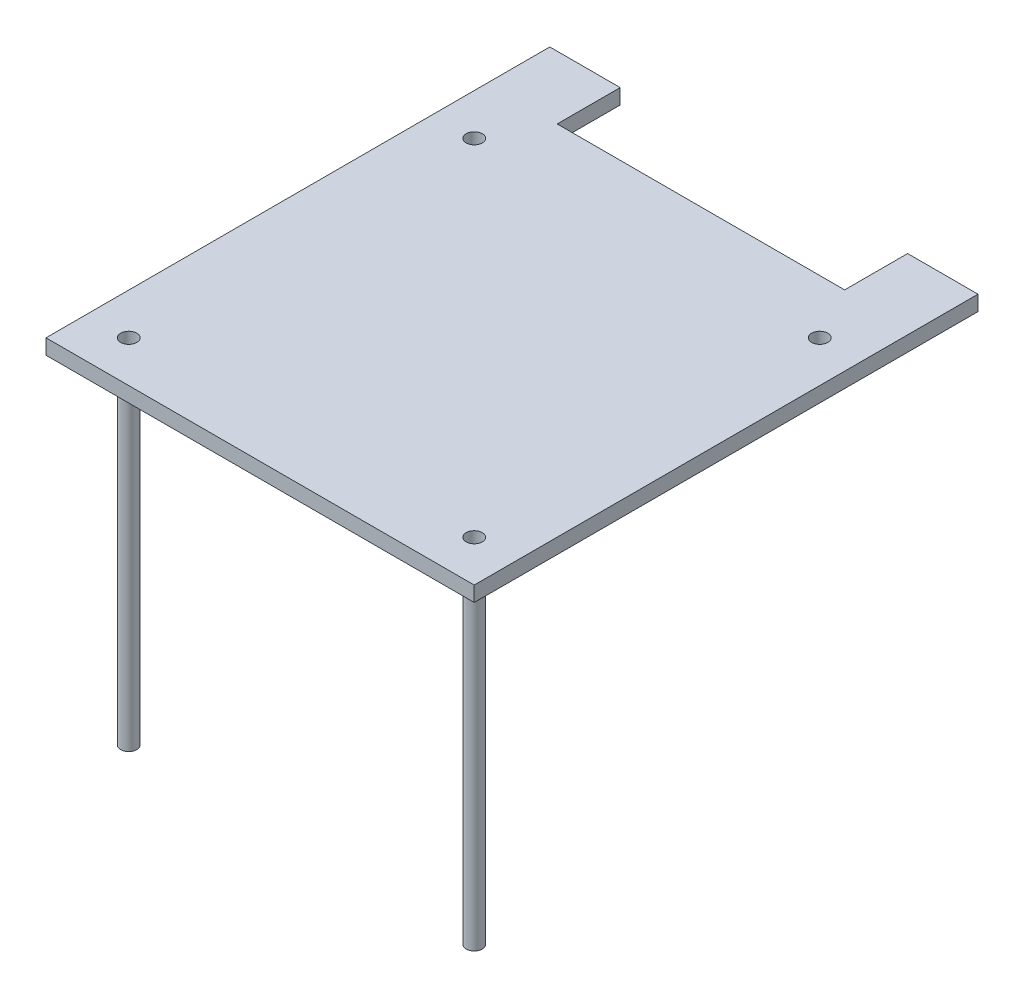
ISO-10303-21;
HEADER;
FILE_DESCRIPTION(('STEP AP214'),'2;1');
FILE_NAME('part.step','',(''),(''),'','','');
FILE_SCHEMA(('AUTOMOTIVE_DESIGN { 1 0 10303 214 1 1 1 1 }'));
ENDSEC;
DATA;
#1=APPLICATION_CONTEXT('core data for automotive mechanical design processes');
#2=APPLICATION_PROTOCOL_DEFINITION('international standard','automotive_design',2000,#1);
#3=PRODUCT_CONTEXT('',#1,'mechanical');
#4=PRODUCT('Part','Part','',(#3));
#5=PRODUCT_RELATED_PRODUCT_CATEGORY('part','',(#4));
#6=PRODUCT_DEFINITION_FORMATION('','',#4);
#7=PRODUCT_DEFINITION_CONTEXT('part definition',#1,'design');
#8=PRODUCT_DEFINITION('design','',#6,#7);
#9=PRODUCT_DEFINITION_SHAPE('','',#8);
#10=(LENGTH_UNIT() NAMED_UNIT(*) SI_UNIT(.MILLI.,.METRE.));
#11=(NAMED_UNIT(*) PLANE_ANGLE_UNIT() SI_UNIT($,.RADIAN.));
#12=(NAMED_UNIT(*) SI_UNIT($,.STERADIAN.) SOLID_ANGLE_UNIT());
#13=UNCERTAINTY_MEASURE_WITH_UNIT(LENGTH_MEASURE(1.E-05),#10,'distance_accuracy_value','');
#14=(GEOMETRIC_REPRESENTATION_CONTEXT(3) GLOBAL_UNCERTAINTY_ASSIGNED_CONTEXT((#13)) GLOBAL_UNIT_ASSIGNED_CONTEXT((#10,
#11,#12)) REPRESENTATION_CONTEXT('',''));
#15=CARTESIAN_POINT('',(0.,0.,0.));
#16=DIRECTION('',(0.,0.,1.));
#17=DIRECTION('',(1.,0.,0.));
#18=AXIS2_PLACEMENT_3D('',#15,#16,#17);
#19=CARTESIAN_POINT('',(34.29,-67.,41.79));
#20=DIRECTION('',(0.,1.,0.));
#21=DIRECTION('',(0.,0.,1.));
#22=AXIS2_PLACEMENT_3D('',#19,#20,#21);
#23=CYLINDRICAL_SURFACE('',#22,1.6);
#24=CARTESIAN_POINT('',(34.29,-67.,41.79));
#25=DIRECTION('',(0.,-1.,0.));
#26=DIRECTION('',(0.,0.,-1.));
#27=AXIS2_PLACEMENT_3D('',#24,#25,#26);
#28=CIRCLE('',#27,1.6);
#29=CARTESIAN_POINT('',(34.29,-67.,40.19));
#30=VERTEX_POINT('',#29);
#31=EDGE_CURVE('E47',#30,#30,#28,.T.);
#32=ORIENTED_EDGE('',*,*,#31,.F.);
#33=EDGE_LOOP('',(#32));
#34=FACE_BOUND('',#33,.T.);
#35=CARTESIAN_POINT('',(34.29,0.,41.79));
#36=DIRECTION('',(0.,-1.,0.));
#37=DIRECTION('',(0.,0.,-1.));
#38=AXIS2_PLACEMENT_3D('',#35,#36,#37);
#39=CIRCLE('',#38,1.6);
#40=CARTESIAN_POINT('',(34.29,0.,40.19));
#41=VERTEX_POINT('',#40);
#42=EDGE_CURVE('E11',#41,#41,#39,.T.);
#43=ORIENTED_EDGE('',*,*,#42,.T.);
#44=EDGE_LOOP('',(#43));
#45=FACE_BOUND('',#44,.T.);
#46=ADVANCED_FACE('F44',(#34,#45),#23,.T.);
#47=CARTESIAN_POINT('',(34.29,-67.,41.79));
#48=DIRECTION('',(0.,-1.,0.));
#49=DIRECTION('',(0.,0.,-1.));
#50=AXIS2_PLACEMENT_3D('',#47,#48,#49);
#51=PLANE('',#50);
#52=ORIENTED_EDGE('',*,*,#31,.T.);
#53=EDGE_LOOP('',(#52));
#54=FACE_BOUND('',#53,.T.);
#55=ADVANCED_FACE('F50',(#54),#51,.T.);
#56=CARTESIAN_POINT('',(34.29,0.,41.79));
#57=DIRECTION('',(0.,-1.,0.));
#58=DIRECTION('',(0.,0.,-1.));
#59=AXIS2_PLACEMENT_3D('',#56,#57,#58);
#60=PLANE('',#59);
#61=ORIENTED_EDGE('',*,*,#42,.F.);
#62=EDGE_LOOP('',(#61));
#63=FACE_BOUND('',#62,.T.);
#64=ADVANCED_FACE('F63',(#63),#60,.F.);
#65=CLOSED_SHELL('',(#46,#55,#64));
#66=MANIFOLD_SOLID_BREP('B2',#65);
#67=CARTESIAN_POINT('',(-34.29,-67.,41.79));
#68=DIRECTION('',(0.,1.,0.));
#69=DIRECTION('',(0.,0.,1.));
#70=AXIS2_PLACEMENT_3D('',#67,#68,#69);
#71=CYLINDRICAL_SURFACE('',#70,1.6);
#72=CARTESIAN_POINT('',(-34.29,-67.,41.79));
#73=DIRECTION('',(0.,-1.,0.));
#74=DIRECTION('',(0.,0.,-1.));
#75=AXIS2_PLACEMENT_3D('',#72,#73,#74);
#76=CIRCLE('',#75,1.6);
#77=CARTESIAN_POINT('',(-34.29,-67.,40.19));
#78=VERTEX_POINT('',#77);
#79=EDGE_CURVE('E42',#78,#78,#76,.T.);
#80=ORIENTED_EDGE('',*,*,#79,.F.);
#81=EDGE_LOOP('',(#80));
#82=FACE_BOUND('',#81,.T.);
#83=CARTESIAN_POINT('',(-34.29,0.,41.79));
#84=DIRECTION('',(0.,-1.,0.));
#85=DIRECTION('',(0.,0.,-1.));
#86=AXIS2_PLACEMENT_3D('',#83,#84,#85);
#87=CIRCLE('',#86,1.6);
#88=CARTESIAN_POINT('',(-34.29,0.,40.19));
#89=VERTEX_POINT('',#88);
#90=EDGE_CURVE('E100',#89,#89,#87,.T.);
#91=ORIENTED_EDGE('',*,*,#90,.T.);
#92=EDGE_LOOP('',(#91));
#93=FACE_BOUND('',#92,.T.);
#94=ADVANCED_FACE('F94',(#82,#93),#71,.T.);
#95=CARTESIAN_POINT('',(-34.29,-67.,41.79));
#96=DIRECTION('',(0.,-1.,0.));
#97=DIRECTION('',(0.,0.,-1.));
#98=AXIS2_PLACEMENT_3D('',#95,#96,#97);
#99=PLANE('',#98);
#100=ORIENTED_EDGE('',*,*,#79,.T.);
#101=EDGE_LOOP('',(#100));
#102=FACE_BOUND('',#101,.T.);
#103=ADVANCED_FACE('F108',(#102),#99,.T.);
#104=CARTESIAN_POINT('',(-34.29,0.,41.79));
#105=DIRECTION('',(0.,-1.,0.));
#106=DIRECTION('',(0.,0.,-1.));
#107=AXIS2_PLACEMENT_3D('',#104,#105,#106);
#108=PLANE('',#107);
#109=ORIENTED_EDGE('',*,*,#90,.F.);
#110=EDGE_LOOP('',(#109));
#111=FACE_BOUND('',#110,.T.);
#112=ADVANCED_FACE('F110',(#111),#108,.F.);
#113=CLOSED_SHELL('',(#94,#103,#112));
#114=MANIFOLD_SOLID_BREP('B6',#113);
#115=CARTESIAN_POINT('',(-42.5,3.,-50.));
#116=DIRECTION('',(0.,0.,1.));
#117=DIRECTION('',(1.,0.,0.));
#118=AXIS2_PLACEMENT_3D('',#115,#116,#117);
#119=PLANE('',#118);
#120=DIRECTION('',(-1.,0.,0.));
#121=VECTOR('',#120,1.);
#122=CARTESIAN_POINT('',(-42.5,0.,-50.));
#123=LINE('',#122,#121);
#124=CARTESIAN_POINT('',(42.5,0.,-50.));
#125=VERTEX_POINT('',#124);
#126=CARTESIAN_POINT('',(28.5283707147738,0.,-50.));
#127=VERTEX_POINT('',#126);
#128=EDGE_CURVE('E269',#125,#127,#123,.T.);
#129=ORIENTED_EDGE('',*,*,#128,.T.);
#130=DIRECTION('',(0.,1.,0.));
#131=VECTOR('',#130,1.);
#132=CARTESIAN_POINT('',(28.5283707147738,3.,-50.));
#133=LINE('',#132,#131);
#134=CARTESIAN_POINT('',(28.5283707147738,3.,-50.));
#135=VERTEX_POINT('',#134);
#136=EDGE_CURVE('E232',#127,#135,#133,.T.);
#137=ORIENTED_EDGE('',*,*,#136,.T.);
#138=DIRECTION('',(-1.,0.,0.));
#139=VECTOR('',#138,1.);
#140=CARTESIAN_POINT('',(-42.5,3.,-50.));
#141=LINE('',#140,#139);
#142=CARTESIAN_POINT('',(42.5,3.,-50.));
#143=VERTEX_POINT('',#142);
#144=EDGE_CURVE('E187',#143,#135,#141,.T.);
#145=ORIENTED_EDGE('',*,*,#144,.F.);
#146=DIRECTION('',(0.,-1.,0.));
#147=VECTOR('',#146,1.);
#148=CARTESIAN_POINT('',(42.5,3.,-50.));
#149=LINE('',#148,#147);
#150=EDGE_CURVE('E285',#143,#125,#149,.T.);
#151=ORIENTED_EDGE('',*,*,#150,.T.);
#152=EDGE_LOOP('',(#129,#137,#145,#151));
#153=FACE_BOUND('',#152,.T.);
#154=ADVANCED_FACE('F134',(#153),#119,.F.);
#155=CARTESIAN_POINT('',(0.,3.,0.));
#156=DIRECTION('',(0.,-1.,0.));
#157=DIRECTION('',(0.,0.,-1.));
#158=AXIS2_PLACEMENT_3D('',#155,#156,#157);
#159=PLANE('',#158);
#160=CARTESIAN_POINT('',(-34.29,3.,41.79));
#161=DIRECTION('',(0.,1.,0.));
#162=DIRECTION('',(0.,0.,1.));
#163=AXIS2_PLACEMENT_3D('',#160,#161,#162);
#164=CIRCLE('',#163,1.6);
#165=CARTESIAN_POINT('',(-34.29,3.,43.39));
#166=VERTEX_POINT('',#165);
#167=EDGE_CURVE('E243',#166,#166,#164,.T.);
#168=ORIENTED_EDGE('',*,*,#167,.F.);
#169=EDGE_LOOP('',(#168));
#170=FACE_BOUND('',#169,.T.);
#171=CARTESIAN_POINT('',(34.29,3.,-26.79));
#172=DIRECTION('',(0.,1.,0.));
#173=DIRECTION('',(0.,0.,-1.));
#174=AXIS2_PLACEMENT_3D('',#171,#172,#173);
#175=CIRCLE('',#174,1.6);
#176=CARTESIAN_POINT('',(34.29,3.,-28.39));
#177=VERTEX_POINT('',#176);
#178=EDGE_CURVE('E235',#177,#177,#175,.T.);
#179=ORIENTED_EDGE('',*,*,#178,.F.);
#180=EDGE_LOOP('',(#179));
#181=FACE_BOUND('',#180,.T.);
#182=CARTESIAN_POINT('',(34.29,3.,41.79));
#183=DIRECTION('',(0.,1.,0.));
#184=DIRECTION('',(0.,0.,-1.));
#185=AXIS2_PLACEMENT_3D('',#182,#183,#184);
#186=CIRCLE('',#185,1.6);
#187=CARTESIAN_POINT('',(34.29,3.,40.19));
#188=VERTEX_POINT('',#187);
#189=EDGE_CURVE('E249',#188,#188,#186,.T.);
#190=ORIENTED_EDGE('',*,*,#189,.F.);
#191=EDGE_LOOP('',(#190));
#192=FACE_BOUND('',#191,.T.);
#193=CARTESIAN_POINT('',(-34.29,3.,-26.79));
#194=DIRECTION('',(0.,1.,0.));
#195=DIRECTION('',(0.,0.,1.));
#196=AXIS2_PLACEMENT_3D('',#193,#194,#195);
#197=CIRCLE('',#196,1.6);
#198=CARTESIAN_POINT('',(-34.29,3.,-25.19));
#199=VERTEX_POINT('',#198);
#200=EDGE_CURVE('E241',#199,#199,#197,.T.);
#201=ORIENTED_EDGE('',*,*,#200,.F.);
#202=EDGE_LOOP('',(#201));
#203=FACE_BOUND('',#202,.T.);
#204=DIRECTION('',(0.,0.,-1.));
#205=VECTOR('',#204,1.);
#206=CARTESIAN_POINT('',(28.5283707147738,3.,-62.5));
#207=LINE('',#206,#205);
#208=CARTESIAN_POINT('',(28.5283707147738,3.,-37.5));
#209=VERTEX_POINT('',#208);
#210=EDGE_CURVE('E221',#209,#135,#207,.T.);
#211=ORIENTED_EDGE('',*,*,#210,.F.);
#212=DIRECTION('',(1.,0.,0.));
#213=VECTOR('',#212,1.);
#214=CARTESIAN_POINT('',(-28.5283707147738,3.,-37.5));
#215=LINE('',#214,#213);
#216=CARTESIAN_POINT('',(-28.5283707147738,3.,-37.5));
#217=VERTEX_POINT('',#216);
#218=EDGE_CURVE('E215',#217,#209,#215,.T.);
#219=ORIENTED_EDGE('',*,*,#218,.F.);
#220=DIRECTION('',(0.,0.,1.));
#221=VECTOR('',#220,1.);
#222=CARTESIAN_POINT('',(-28.5283707147738,3.,-62.5));
#223=LINE('',#222,#221);
#224=CARTESIAN_POINT('',(-28.5283707147738,3.,-50.));
#225=VERTEX_POINT('',#224);
#226=EDGE_CURVE('E218',#225,#217,#223,.T.);
#227=ORIENTED_EDGE('',*,*,#226,.F.);
#228=CARTESIAN_POINT('',(-42.5,3.,-50.));
#229=VERTEX_POINT('',#228);
#230=EDGE_CURVE('E261',#225,#229,#141,.T.);
#231=ORIENTED_EDGE('',*,*,#230,.T.);
#232=DIRECTION('',(0.,0.,1.));
#233=VECTOR('',#232,1.);
#234=CARTESIAN_POINT('',(-42.5,3.,50.));
#235=LINE('',#234,#233);
#236=CARTESIAN_POINT('',(-42.5,3.,50.));
#237=VERTEX_POINT('',#236);
#238=EDGE_CURVE('E263',#229,#237,#235,.T.);
#239=ORIENTED_EDGE('',*,*,#238,.T.);
#240=DIRECTION('',(1.,0.,0.));
#241=VECTOR('',#240,1.);
#242=CARTESIAN_POINT('',(-42.5,3.,50.));
#243=LINE('',#242,#241);
#244=CARTESIAN_POINT('',(42.5,3.,50.));
#245=VERTEX_POINT('',#244);
#246=EDGE_CURVE('E157',#237,#245,#243,.T.);
#247=ORIENTED_EDGE('',*,*,#246,.T.);
#248=DIRECTION('',(0.,0.,-1.));
#249=VECTOR('',#248,1.);
#250=CARTESIAN_POINT('',(42.5,3.,50.));
#251=LINE('',#250,#249);
#252=EDGE_CURVE('E259',#245,#143,#251,.T.);
#253=ORIENTED_EDGE('',*,*,#252,.T.);
#254=ORIENTED_EDGE('',*,*,#144,.T.);
#255=EDGE_LOOP('',(#211,#219,#227,#231,#239,#247,#253,#254));
#256=FACE_BOUND('',#255,.T.);
#257=ADVANCED_FACE('F226',(#170,#181,#192,#203,#256),#159,.F.);
#258=CARTESIAN_POINT('',(42.5,3.,50.));
#259=DIRECTION('',(-1.,0.,0.));
#260=DIRECTION('',(0.,0.,1.));
#261=AXIS2_PLACEMENT_3D('',#258,#259,#260);
#262=PLANE('',#261);
#263=DIRECTION('',(0.,0.,-1.));
#264=VECTOR('',#263,1.);
#265=CARTESIAN_POINT('',(42.5,0.,50.));
#266=LINE('',#265,#264);
#267=CARTESIAN_POINT('',(42.5,0.,50.));
#268=VERTEX_POINT('',#267);
#269=EDGE_CURVE('E258',#268,#125,#266,.T.);
#270=ORIENTED_EDGE('',*,*,#269,.T.);
#271=ORIENTED_EDGE('',*,*,#150,.F.);
#272=ORIENTED_EDGE('',*,*,#252,.F.);
#273=DIRECTION('',(0.,-1.,0.));
#274=VECTOR('',#273,1.);
#275=CARTESIAN_POINT('',(42.5,3.,50.));
#276=LINE('',#275,#274);
#277=EDGE_CURVE('E266',#245,#268,#276,.T.);
#278=ORIENTED_EDGE('',*,*,#277,.T.);
#279=EDGE_LOOP('',(#270,#271,#272,#278));
#280=FACE_BOUND('',#279,.T.);
#281=ADVANCED_FACE('F137',(#280),#262,.F.);
#282=ORIENTED_EDGE('',*,*,#230,.F.);
#283=DIRECTION('',(0.,-1.,0.));
#284=VECTOR('',#283,1.);
#285=CARTESIAN_POINT('',(-28.5283707147738,3.,-50.));
#286=LINE('',#285,#284);
#287=CARTESIAN_POINT('',(-28.5283707147738,0.,-50.));
#288=VERTEX_POINT('',#287);
#289=EDGE_CURVE('E225',#225,#288,#286,.T.);
#290=ORIENTED_EDGE('',*,*,#289,.T.);
#291=CARTESIAN_POINT('',(-42.5,0.,-50.));
#292=VERTEX_POINT('',#291);
#293=EDGE_CURVE('E267',#288,#292,#123,.T.);
#294=ORIENTED_EDGE('',*,*,#293,.T.);
#295=DIRECTION('',(0.,-1.,0.));
#296=VECTOR('',#295,1.);
#297=CARTESIAN_POINT('',(-42.5,3.,-50.));
#298=LINE('',#297,#296);
#299=EDGE_CURVE('E276',#229,#292,#298,.T.);
#300=ORIENTED_EDGE('',*,*,#299,.F.);
#301=EDGE_LOOP('',(#282,#290,#294,#300));
#302=FACE_BOUND('',#301,.T.);
#303=ADVANCED_FACE('F289',(#302),#119,.F.);
#304=CARTESIAN_POINT('',(-42.5,3.,50.));
#305=DIRECTION('',(1.,0.,0.));
#306=DIRECTION('',(0.,0.,-1.));
#307=AXIS2_PLACEMENT_3D('',#304,#305,#306);
#308=PLANE('',#307);
#309=DIRECTION('',(0.,0.,1.));
#310=VECTOR('',#309,1.);
#311=CARTESIAN_POINT('',(-42.5,0.,50.));
#312=LINE('',#311,#310);
#313=CARTESIAN_POINT('',(-42.5,0.,50.));
#314=VERTEX_POINT('',#313);
#315=EDGE_CURVE('E272',#292,#314,#312,.T.);
#316=ORIENTED_EDGE('',*,*,#315,.T.);
#317=DIRECTION('',(0.,-1.,0.));
#318=VECTOR('',#317,1.);
#319=CARTESIAN_POINT('',(-42.5,3.,50.));
#320=LINE('',#319,#318);
#321=EDGE_CURVE('E280',#237,#314,#320,.T.);
#322=ORIENTED_EDGE('',*,*,#321,.F.);
#323=ORIENTED_EDGE('',*,*,#238,.F.);
#324=ORIENTED_EDGE('',*,*,#299,.T.);
#325=EDGE_LOOP('',(#316,#322,#323,#324));
#326=FACE_BOUND('',#325,.T.);
#327=ADVANCED_FACE('F300',(#326),#308,.F.);
#328=CARTESIAN_POINT('',(-42.5,3.,50.));
#329=DIRECTION('',(0.,0.,-1.));
#330=DIRECTION('',(-1.,0.,0.));
#331=AXIS2_PLACEMENT_3D('',#328,#329,#330);
#332=PLANE('',#331);
#333=DIRECTION('',(1.,0.,0.));
#334=VECTOR('',#333,1.);
#335=CARTESIAN_POINT('',(-42.5,0.,50.));
#336=LINE('',#335,#334);
#337=EDGE_CURVE('E180',#314,#268,#336,.T.);
#338=ORIENTED_EDGE('',*,*,#337,.T.);
#339=ORIENTED_EDGE('',*,*,#277,.F.);
#340=ORIENTED_EDGE('',*,*,#246,.F.);
#341=ORIENTED_EDGE('',*,*,#321,.T.);
#342=EDGE_LOOP('',(#338,#339,#340,#341));
#343=FACE_BOUND('',#342,.T.);
#344=ADVANCED_FACE('F298',(#343),#332,.F.);
#345=CARTESIAN_POINT('',(0.,0.,0.));
#346=DIRECTION('',(0.,-1.,0.));
#347=DIRECTION('',(0.,0.,-1.));
#348=AXIS2_PLACEMENT_3D('',#345,#346,#347);
#349=PLANE('',#348);
#350=DIRECTION('',(0.,0.,1.));
#351=VECTOR('',#350,1.);
#352=CARTESIAN_POINT('',(28.5283707147738,0.,0.));
#353=LINE('',#352,#351);
#354=CARTESIAN_POINT('',(28.5283707147738,0.,-37.5));
#355=VERTEX_POINT('',#354);
#356=EDGE_CURVE('E95',#127,#355,#353,.T.);
#357=ORIENTED_EDGE('',*,*,#356,.F.);
#358=ORIENTED_EDGE('',*,*,#128,.F.);
#359=ORIENTED_EDGE('',*,*,#269,.F.);
#360=ORIENTED_EDGE('',*,*,#337,.F.);
#361=ORIENTED_EDGE('',*,*,#315,.F.);
#362=ORIENTED_EDGE('',*,*,#293,.F.);
#363=DIRECTION('',(0.,0.,-1.));
#364=VECTOR('',#363,1.);
#365=CARTESIAN_POINT('',(-28.5283707147738,0.,0.));
#366=LINE('',#365,#364);
#367=CARTESIAN_POINT('',(-28.5283707147738,0.,-37.5));
#368=VERTEX_POINT('',#367);
#369=EDGE_CURVE('E283',#368,#288,#366,.T.);
#370=ORIENTED_EDGE('',*,*,#369,.F.);
#371=DIRECTION('',(-1.,0.,0.));
#372=VECTOR('',#371,1.);
#373=CARTESIAN_POINT('',(0.,0.,-37.5));
#374=LINE('',#373,#372);
#375=EDGE_CURVE('E141',#355,#368,#374,.T.);
#376=ORIENTED_EDGE('',*,*,#375,.F.);
#377=EDGE_LOOP('',(#357,#358,#359,#360,#361,#362,#370,#376));
#378=FACE_BOUND('',#377,.T.);
#379=CARTESIAN_POINT('',(-34.29,0.,-26.79));
#380=DIRECTION('',(0.,1.,0.));
#381=DIRECTION('',(0.,0.,1.));
#382=AXIS2_PLACEMENT_3D('',#379,#380,#381);
#383=CIRCLE('',#382,1.6);
#384=CARTESIAN_POINT('',(-34.29,0.,-25.19));
#385=VERTEX_POINT('',#384);
#386=EDGE_CURVE('E244',#385,#385,#383,.T.);
#387=ORIENTED_EDGE('',*,*,#386,.T.);
#388=EDGE_LOOP('',(#387));
#389=FACE_BOUND('',#388,.T.);
#390=CARTESIAN_POINT('',(34.29,0.,41.79));
#391=DIRECTION('',(0.,1.,0.));
#392=DIRECTION('',(0.,0.,-1.));
#393=AXIS2_PLACEMENT_3D('',#390,#391,#392);
#394=CIRCLE('',#393,1.6);
#395=CARTESIAN_POINT('',(34.29,0.,40.19));
#396=VERTEX_POINT('',#395);
#397=EDGE_CURVE('E236',#396,#396,#394,.T.);
#398=ORIENTED_EDGE('',*,*,#397,.T.);
#399=EDGE_LOOP('',(#398));
#400=FACE_BOUND('',#399,.T.);
#401=CARTESIAN_POINT('',(34.29,0.,-26.79));
#402=DIRECTION('',(0.,1.,0.));
#403=DIRECTION('',(0.,0.,-1.));
#404=AXIS2_PLACEMENT_3D('',#401,#402,#403);
#405=CIRCLE('',#404,1.6);
#406=CARTESIAN_POINT('',(34.29,0.,-28.39));
#407=VERTEX_POINT('',#406);
#408=EDGE_CURVE('E233',#407,#407,#405,.T.);
#409=ORIENTED_EDGE('',*,*,#408,.T.);
#410=EDGE_LOOP('',(#409));
#411=FACE_BOUND('',#410,.T.);
#412=CARTESIAN_POINT('',(-34.29,0.,41.79));
#413=DIRECTION('',(0.,1.,0.));
#414=DIRECTION('',(0.,0.,1.));
#415=AXIS2_PLACEMENT_3D('',#412,#413,#414);
#416=CIRCLE('',#415,1.6);
#417=CARTESIAN_POINT('',(-34.29,0.,43.39));
#418=VERTEX_POINT('',#417);
#419=EDGE_CURVE('E251',#418,#418,#416,.T.);
#420=ORIENTED_EDGE('',*,*,#419,.T.);
#421=EDGE_LOOP('',(#420));
#422=FACE_BOUND('',#421,.T.);
#423=ADVANCED_FACE('F295',(#378,#389,#400,#411,#422),#349,.T.);
#424=CARTESIAN_POINT('',(-34.29,0.,41.79));
#425=DIRECTION('',(0.,1.,0.));
#426=DIRECTION('',(0.,0.,1.));
#427=AXIS2_PLACEMENT_3D('',#424,#425,#426);
#428=CYLINDRICAL_SURFACE('',#427,1.6);
#429=ORIENTED_EDGE('',*,*,#419,.F.);
#430=EDGE_LOOP('',(#429));
#431=FACE_BOUND('',#430,.T.);
#432=ORIENTED_EDGE('',*,*,#167,.T.);
#433=EDGE_LOOP('',(#432));
#434=FACE_BOUND('',#433,.T.);
#435=ADVANCED_FACE('F349',(#431,#434),#428,.F.);
#436=CARTESIAN_POINT('',(34.29,0.,-26.79));
#437=DIRECTION('',(0.,1.,0.));
#438=DIRECTION('',(0.,0.,1.));
#439=AXIS2_PLACEMENT_3D('',#436,#437,#438);
#440=CYLINDRICAL_SURFACE('',#439,1.6);
#441=ORIENTED_EDGE('',*,*,#408,.F.);
#442=EDGE_LOOP('',(#441));
#443=FACE_BOUND('',#442,.T.);
#444=ORIENTED_EDGE('',*,*,#178,.T.);
#445=EDGE_LOOP('',(#444));
#446=FACE_BOUND('',#445,.T.);
#447=ADVANCED_FACE('F352',(#443,#446),#440,.F.);
#448=CARTESIAN_POINT('',(34.29,0.,41.79));
#449=DIRECTION('',(0.,1.,0.));
#450=DIRECTION('',(0.,0.,1.));
#451=AXIS2_PLACEMENT_3D('',#448,#449,#450);
#452=CYLINDRICAL_SURFACE('',#451,1.6);
#453=ORIENTED_EDGE('',*,*,#397,.F.);
#454=EDGE_LOOP('',(#453));
#455=FACE_BOUND('',#454,.T.);
#456=ORIENTED_EDGE('',*,*,#189,.T.);
#457=EDGE_LOOP('',(#456));
#458=FACE_BOUND('',#457,.T.);
#459=ADVANCED_FACE('F314',(#455,#458),#452,.F.);
#460=CARTESIAN_POINT('',(-34.29,0.,-26.79));
#461=DIRECTION('',(0.,1.,0.));
#462=DIRECTION('',(0.,0.,1.));
#463=AXIS2_PLACEMENT_3D('',#460,#461,#462);
#464=CYLINDRICAL_SURFACE('',#463,1.6);
#465=ORIENTED_EDGE('',*,*,#386,.F.);
#466=EDGE_LOOP('',(#465));
#467=FACE_BOUND('',#466,.T.);
#468=ORIENTED_EDGE('',*,*,#200,.T.);
#469=EDGE_LOOP('',(#468));
#470=FACE_BOUND('',#469,.T.);
#471=ADVANCED_FACE('F308',(#467,#470),#464,.F.);
#472=CARTESIAN_POINT('',(28.5283707147738,-67.,-62.5));
#473=DIRECTION('',(1.,0.,0.));
#474=DIRECTION('',(0.,0.,-1.));
#475=AXIS2_PLACEMENT_3D('',#472,#473,#474);
#476=PLANE('',#475);
#477=ORIENTED_EDGE('',*,*,#356,.T.);
#478=DIRECTION('',(0.,1.,0.));
#479=VECTOR('',#478,1.);
#480=CARTESIAN_POINT('',(28.5283707147738,-67.,-37.5));
#481=LINE('',#480,#479);
#482=EDGE_CURVE('E216',#355,#209,#481,.T.);
#483=ORIENTED_EDGE('',*,*,#482,.T.);
#484=ORIENTED_EDGE('',*,*,#210,.T.);
#485=ORIENTED_EDGE('',*,*,#136,.F.);
#486=EDGE_LOOP('',(#477,#483,#484,#485));
#487=FACE_BOUND('',#486,.T.);
#488=ADVANCED_FACE('F303',(#487),#476,.F.);
#489=CARTESIAN_POINT('',(-28.5283707147738,-67.,-62.5));
#490=DIRECTION('',(-1.,0.,0.));
#491=DIRECTION('',(0.,0.,1.));
#492=AXIS2_PLACEMENT_3D('',#489,#490,#491);
#493=PLANE('',#492);
#494=ORIENTED_EDGE('',*,*,#226,.T.);
#495=DIRECTION('',(0.,1.,0.));
#496=VECTOR('',#495,1.);
#497=CARTESIAN_POINT('',(-28.5283707147738,-67.,-37.5));
#498=LINE('',#497,#496);
#499=EDGE_CURVE('E147',#368,#217,#498,.T.);
#500=ORIENTED_EDGE('',*,*,#499,.F.);
#501=ORIENTED_EDGE('',*,*,#369,.T.);
#502=ORIENTED_EDGE('',*,*,#289,.F.);
#503=EDGE_LOOP('',(#494,#500,#501,#502));
#504=FACE_BOUND('',#503,.T.);
#505=ADVANCED_FACE('F219',(#504),#493,.F.);
#506=CARTESIAN_POINT('',(-28.5283707147738,-67.,-37.5));
#507=DIRECTION('',(0.,0.,1.));
#508=DIRECTION('',(1.,0.,0.));
#509=AXIS2_PLACEMENT_3D('',#506,#507,#508);
#510=PLANE('',#509);
#511=ORIENTED_EDGE('',*,*,#375,.T.);
#512=ORIENTED_EDGE('',*,*,#499,.T.);
#513=ORIENTED_EDGE('',*,*,#218,.T.);
#514=ORIENTED_EDGE('',*,*,#482,.F.);
#515=EDGE_LOOP('',(#511,#512,#513,#514));
#516=FACE_BOUND('',#515,.T.);
#517=ADVANCED_FACE('F207',(#516),#510,.F.);
#518=CLOSED_SHELL('',(#154,#257,#281,#303,#327,#344,#423,#435,#447,#459,#471,#488,#505,#517));
#519=MANIFOLD_SOLID_BREP('B39',#518);
#520=ADVANCED_BREP_SHAPE_REPRESENTATION('',(#18,#66,#114,#519),#14);
#521=SHAPE_DEFINITION_REPRESENTATION(#9,#520);
ENDSEC;
END-ISO-10303-21;
